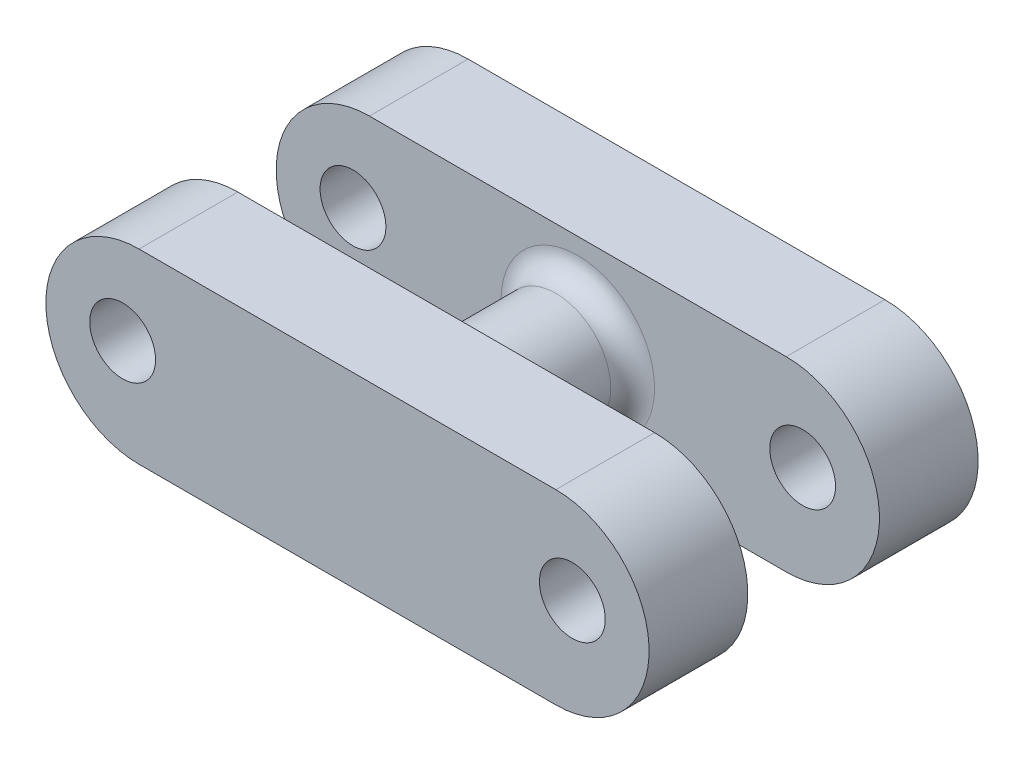
ISO-10303-21;
HEADER;
FILE_DESCRIPTION(('STEP AP214'),'2;1');
FILE_NAME('part.step','',(''),(''),'','','');
FILE_SCHEMA(('AUTOMOTIVE_DESIGN { 1 0 10303 214 1 1 1 1 }'));
ENDSEC;
DATA;
#1=APPLICATION_CONTEXT('core data for automotive mechanical design processes');
#2=APPLICATION_PROTOCOL_DEFINITION('international standard','automotive_design',2000,#1);
#3=PRODUCT_CONTEXT('',#1,'mechanical');
#4=PRODUCT('Part','Part','',(#3));
#5=PRODUCT_RELATED_PRODUCT_CATEGORY('part','',(#4));
#6=PRODUCT_DEFINITION_FORMATION('','',#4);
#7=PRODUCT_DEFINITION_CONTEXT('part definition',#1,'design');
#8=PRODUCT_DEFINITION('design','',#6,#7);
#9=PRODUCT_DEFINITION_SHAPE('','',#8);
#10=(LENGTH_UNIT() NAMED_UNIT(*) SI_UNIT(.MILLI.,.METRE.));
#11=(NAMED_UNIT(*) PLANE_ANGLE_UNIT() SI_UNIT($,.RADIAN.));
#12=(NAMED_UNIT(*) SI_UNIT($,.STERADIAN.) SOLID_ANGLE_UNIT());
#13=UNCERTAINTY_MEASURE_WITH_UNIT(LENGTH_MEASURE(1.E-05),#10,'distance_accuracy_value','');
#14=(GEOMETRIC_REPRESENTATION_CONTEXT(3) GLOBAL_UNCERTAINTY_ASSIGNED_CONTEXT((#13)) GLOBAL_UNIT_ASSIGNED_CONTEXT((#10,
#11,#12)) REPRESENTATION_CONTEXT('',''));
#15=CARTESIAN_POINT('',(0.,0.,0.));
#16=DIRECTION('',(0.,0.,1.));
#17=DIRECTION('',(1.,0.,0.));
#18=AXIS2_PLACEMENT_3D('',#15,#16,#17);
#19=CARTESIAN_POINT('',(8.49999999999999,8.49999999999999,21.));
#20=DIRECTION('',(0.,0.,-1.));
#21=DIRECTION('',(-1.,0.,0.));
#22=AXIS2_PLACEMENT_3D('',#19,#20,#21);
#23=CYLINDRICAL_SURFACE('',#22,8.49999999999999);
#24=DIRECTION('',(0.,0.,-1.));
#25=VECTOR('',#24,1.);
#26=CARTESIAN_POINT('',(8.49999999999999,17.,30.));
#27=LINE('',#26,#25);
#28=CARTESIAN_POINT('',(8.49999999999999,17.,21.));
#29=VERTEX_POINT('',#28);
#30=CARTESIAN_POINT('',(8.5,17.,30.));
#31=VERTEX_POINT('',#30);
#32=EDGE_CURVE('E154',#29,#31,#27,.F.);
#33=ORIENTED_EDGE('',*,*,#32,.F.);
#34=CARTESIAN_POINT('',(8.49999999999999,8.49999999999999,21.));
#35=DIRECTION('',(0.,0.,1.));
#36=DIRECTION('',(1.,0.,0.));
#37=AXIS2_PLACEMENT_3D('',#34,#35,#36);
#38=CIRCLE('',#37,8.49999999999999);
#39=CARTESIAN_POINT('',(8.5,0.,21.));
#40=VERTEX_POINT('',#39);
#41=EDGE_CURVE('E46',#40,#29,#38,.F.);
#42=ORIENTED_EDGE('',*,*,#41,.F.);
#43=DIRECTION('',(0.,0.,-1.));
#44=VECTOR('',#43,1.);
#45=CARTESIAN_POINT('',(8.49999999999999,0.,30.));
#46=LINE('',#45,#44);
#47=CARTESIAN_POINT('',(8.5,0.,30.));
#48=VERTEX_POINT('',#47);
#49=EDGE_CURVE('E157',#48,#40,#46,.T.);
#50=ORIENTED_EDGE('',*,*,#49,.F.);
#51=CARTESIAN_POINT('',(8.49999999999999,8.49999999999999,30.));
#52=DIRECTION('',(0.,0.,-1.));
#53=DIRECTION('',(-1.,0.,0.));
#54=AXIS2_PLACEMENT_3D('',#51,#52,#53);
#55=CIRCLE('',#54,8.49999999999999);
#56=EDGE_CURVE('E11',#31,#48,#55,.F.);
#57=ORIENTED_EDGE('',*,*,#56,.F.);
#58=EDGE_LOOP('',(#33,#42,#50,#57));
#59=FACE_BOUND('',#58,.T.);
#60=ADVANCED_FACE('F38',(#59),#23,.T.);
#61=CARTESIAN_POINT('',(8.5,8.5,0.));
#62=DIRECTION('',(0.,0.,-1.));
#63=DIRECTION('',(-1.,0.,0.));
#64=AXIS2_PLACEMENT_3D('',#61,#62,#63);
#65=CYLINDRICAL_SURFACE('',#64,8.5);
#66=DIRECTION('',(0.,0.,-1.));
#67=VECTOR('',#66,1.);
#68=CARTESIAN_POINT('',(8.5,17.,30.));
#69=LINE('',#68,#67);
#70=CARTESIAN_POINT('',(8.5,17.,0.));
#71=VERTEX_POINT('',#70);
#72=CARTESIAN_POINT('',(8.49999999999999,17.,9.));
#73=VERTEX_POINT('',#72);
#74=EDGE_CURVE('E109',#71,#73,#69,.F.);
#75=ORIENTED_EDGE('',*,*,#74,.F.);
#76=CARTESIAN_POINT('',(8.5,8.5,0.));
#77=DIRECTION('',(0.,0.,-1.));
#78=DIRECTION('',(-1.,0.,0.));
#79=AXIS2_PLACEMENT_3D('',#76,#77,#78);
#80=CIRCLE('',#79,8.5);
#81=CARTESIAN_POINT('',(8.50000000000001,0.,0.));
#82=VERTEX_POINT('',#81);
#83=EDGE_CURVE('E150',#82,#71,#80,.T.);
#84=ORIENTED_EDGE('',*,*,#83,.F.);
#85=DIRECTION('',(0.,0.,-1.));
#86=VECTOR('',#85,1.);
#87=CARTESIAN_POINT('',(8.5,0.,30.));
#88=LINE('',#87,#86);
#89=CARTESIAN_POINT('',(8.5,0.,9.));
#90=VERTEX_POINT('',#89);
#91=EDGE_CURVE('E147',#90,#82,#88,.T.);
#92=ORIENTED_EDGE('',*,*,#91,.F.);
#93=CARTESIAN_POINT('',(8.5,8.5,9.));
#94=DIRECTION('',(0.,0.,-1.));
#95=DIRECTION('',(-1.,0.,0.));
#96=AXIS2_PLACEMENT_3D('',#93,#94,#95);
#97=CIRCLE('',#96,8.5);
#98=EDGE_CURVE('E152',#73,#90,#97,.F.);
#99=ORIENTED_EDGE('',*,*,#98,.F.);
#100=EDGE_LOOP('',(#75,#84,#92,#99));
#101=FACE_BOUND('',#100,.T.);
#102=ADVANCED_FACE('F238',(#101),#65,.T.);
#103=CARTESIAN_POINT('',(46.5,8.5,30.));
#104=DIRECTION('',(0.,0.,-1.));
#105=DIRECTION('',(-1.,0.,0.));
#106=AXIS2_PLACEMENT_3D('',#103,#104,#105);
#107=CYLINDRICAL_SURFACE('',#106,8.5);
#108=DIRECTION('',(0.,0.,-1.));
#109=VECTOR('',#108,1.);
#110=CARTESIAN_POINT('',(46.5,17.,30.));
#111=LINE('',#110,#109);
#112=CARTESIAN_POINT('',(46.5,17.,30.));
#113=VERTEX_POINT('',#112);
#114=CARTESIAN_POINT('',(46.5,17.,21.));
#115=VERTEX_POINT('',#114);
#116=EDGE_CURVE('E135',#113,#115,#111,.T.);
#117=ORIENTED_EDGE('',*,*,#116,.F.);
#118=CARTESIAN_POINT('',(46.5,8.5,30.));
#119=DIRECTION('',(0.,0.,-1.));
#120=DIRECTION('',(-1.,0.,0.));
#121=AXIS2_PLACEMENT_3D('',#118,#119,#120);
#122=CIRCLE('',#121,8.5);
#123=CARTESIAN_POINT('',(46.5,0.,30.));
#124=VERTEX_POINT('',#123);
#125=EDGE_CURVE('E141',#124,#113,#122,.F.);
#126=ORIENTED_EDGE('',*,*,#125,.F.);
#127=DIRECTION('',(0.,0.,-1.));
#128=VECTOR('',#127,1.);
#129=CARTESIAN_POINT('',(46.5,0.,30.));
#130=LINE('',#129,#128);
#131=CARTESIAN_POINT('',(46.5,0.,21.));
#132=VERTEX_POINT('',#131);
#133=EDGE_CURVE('E138',#132,#124,#130,.F.);
#134=ORIENTED_EDGE('',*,*,#133,.F.);
#135=CARTESIAN_POINT('',(46.5,8.5,21.));
#136=DIRECTION('',(0.,0.,1.));
#137=DIRECTION('',(1.,0.,0.));
#138=AXIS2_PLACEMENT_3D('',#135,#136,#137);
#139=CIRCLE('',#138,8.5);
#140=EDGE_CURVE('E143',#115,#132,#139,.F.);
#141=ORIENTED_EDGE('',*,*,#140,.F.);
#142=EDGE_LOOP('',(#117,#126,#134,#141));
#143=FACE_BOUND('',#142,.T.);
#144=ADVANCED_FACE('F242',(#143),#107,.T.);
#145=CARTESIAN_POINT('',(46.5,8.5,9.));
#146=DIRECTION('',(0.,0.,-1.));
#147=DIRECTION('',(-1.,0.,0.));
#148=AXIS2_PLACEMENT_3D('',#145,#146,#147);
#149=CYLINDRICAL_SURFACE('',#148,8.49999999999999);
#150=DIRECTION('',(0.,0.,-1.));
#151=VECTOR('',#150,1.);
#152=CARTESIAN_POINT('',(46.5,17.,30.));
#153=LINE('',#152,#151);
#154=CARTESIAN_POINT('',(46.5,17.,9.));
#155=VERTEX_POINT('',#154);
#156=CARTESIAN_POINT('',(46.5,17.,0.));
#157=VERTEX_POINT('',#156);
#158=EDGE_CURVE('E106',#155,#157,#153,.T.);
#159=ORIENTED_EDGE('',*,*,#158,.F.);
#160=CARTESIAN_POINT('',(46.5,8.5,9.));
#161=DIRECTION('',(0.,0.,-1.));
#162=DIRECTION('',(-1.,0.,0.));
#163=AXIS2_PLACEMENT_3D('',#160,#161,#162);
#164=CIRCLE('',#163,8.49999999999999);
#165=CARTESIAN_POINT('',(46.5,0.,9.));
#166=VERTEX_POINT('',#165);
#167=EDGE_CURVE('E115',#166,#155,#164,.F.);
#168=ORIENTED_EDGE('',*,*,#167,.F.);
#169=DIRECTION('',(0.,0.,-1.));
#170=VECTOR('',#169,1.);
#171=CARTESIAN_POINT('',(46.5,0.,30.));
#172=LINE('',#171,#170);
#173=CARTESIAN_POINT('',(46.5,0.,0.));
#174=VERTEX_POINT('',#173);
#175=EDGE_CURVE('E122',#174,#166,#172,.F.);
#176=ORIENTED_EDGE('',*,*,#175,.F.);
#177=CARTESIAN_POINT('',(46.5,8.5,0.));
#178=DIRECTION('',(0.,0.,-1.));
#179=DIRECTION('',(-1.,0.,0.));
#180=AXIS2_PLACEMENT_3D('',#177,#178,#179);
#181=CIRCLE('',#180,8.49999999999999);
#182=EDGE_CURVE('E121',#157,#174,#181,.T.);
#183=ORIENTED_EDGE('',*,*,#182,.F.);
#184=EDGE_LOOP('',(#159,#168,#176,#183));
#185=FACE_BOUND('',#184,.T.);
#186=ADVANCED_FACE('F124',(#185),#149,.T.);
#187=CARTESIAN_POINT('',(27.5,8.5,44.142135623731));
#188=DIRECTION('',(0.,0.,-1.));
#189=DIRECTION('',(-1.,0.,0.));
#190=AXIS2_PLACEMENT_3D('',#187,#188,#189);
#191=CYLINDRICAL_SURFACE('',#190,5.);
#192=CARTESIAN_POINT('',(27.5,8.5,11.));
#193=DIRECTION('',(0.,0.,-1.));
#194=DIRECTION('',(-1.,0.,0.));
#195=AXIS2_PLACEMENT_3D('',#192,#193,#194);
#196=CIRCLE('',#195,5.);
#197=CARTESIAN_POINT('',(22.5,8.5,11.));
#198=VERTEX_POINT('',#197);
#199=EDGE_CURVE('E130',#198,#198,#196,.F.);
#200=ORIENTED_EDGE('',*,*,#199,.T.);
#201=EDGE_LOOP('',(#200));
#202=FACE_BOUND('',#201,.T.);
#203=CARTESIAN_POINT('',(27.5,8.5,19.));
#204=DIRECTION('',(0.,0.,1.));
#205=DIRECTION('',(1.,0.,0.));
#206=AXIS2_PLACEMENT_3D('',#203,#204,#205);
#207=CIRCLE('',#206,5.);
#208=CARTESIAN_POINT('',(32.5,8.5,19.));
#209=VERTEX_POINT('',#208);
#210=EDGE_CURVE('E196',#209,#209,#207,.F.);
#211=ORIENTED_EDGE('',*,*,#210,.T.);
#212=EDGE_LOOP('',(#211));
#213=FACE_BOUND('',#212,.T.);
#214=ADVANCED_FACE('F201',(#202,#213),#191,.T.);
#215=CARTESIAN_POINT('',(55.,0.,30.));
#216=DIRECTION('',(0.,1.,0.));
#217=DIRECTION('',(-1.,0.,0.));
#218=AXIS2_PLACEMENT_3D('',#215,#216,#217);
#219=PLANE('',#218);
#220=DIRECTION('',(1.,0.,0.));
#221=VECTOR('',#220,1.);
#222=CARTESIAN_POINT('',(0.,0.,9.));
#223=LINE('',#222,#221);
#224=EDGE_CURVE('E112',#90,#166,#223,.T.);
#225=ORIENTED_EDGE('',*,*,#224,.F.);
#226=ORIENTED_EDGE('',*,*,#91,.T.);
#227=DIRECTION('',(1.,0.,0.));
#228=VECTOR('',#227,1.);
#229=CARTESIAN_POINT('',(55.,0.,0.));
#230=LINE('',#229,#228);
#231=EDGE_CURVE('E189',#82,#174,#230,.T.);
#232=ORIENTED_EDGE('',*,*,#231,.T.);
#233=ORIENTED_EDGE('',*,*,#175,.T.);
#234=EDGE_LOOP('',(#225,#226,#232,#233));
#235=FACE_BOUND('',#234,.T.);
#236=ADVANCED_FACE('F265',(#235),#219,.F.);
#237=CARTESIAN_POINT('',(0.,17.,30.));
#238=DIRECTION('',(0.,-1.,0.));
#239=DIRECTION('',(0.,0.,-1.));
#240=AXIS2_PLACEMENT_3D('',#237,#238,#239);
#241=PLANE('',#240);
#242=DIRECTION('',(-1.,0.,0.));
#243=VECTOR('',#242,1.);
#244=CARTESIAN_POINT('',(0.,17.,0.));
#245=LINE('',#244,#243);
#246=EDGE_CURVE('E187',#157,#71,#245,.T.);
#247=ORIENTED_EDGE('',*,*,#246,.T.);
#248=ORIENTED_EDGE('',*,*,#74,.T.);
#249=DIRECTION('',(1.,0.,0.));
#250=VECTOR('',#249,1.);
#251=CARTESIAN_POINT('',(0.,17.,9.));
#252=LINE('',#251,#250);
#253=EDGE_CURVE('E101',#73,#155,#252,.T.);
#254=ORIENTED_EDGE('',*,*,#253,.T.);
#255=ORIENTED_EDGE('',*,*,#158,.T.);
#256=EDGE_LOOP('',(#247,#248,#254,#255));
#257=FACE_BOUND('',#256,.T.);
#258=ADVANCED_FACE('F104',(#257),#241,.F.);
#259=CARTESIAN_POINT('',(48.,9.,30.));
#260=DIRECTION('',(0.,0.,-1.));
#261=DIRECTION('',(-1.,0.,0.));
#262=AXIS2_PLACEMENT_3D('',#259,#260,#261);
#263=CYLINDRICAL_SURFACE('',#262,3.00000000000001);
#264=CARTESIAN_POINT('',(48.,9.,9.));
#265=DIRECTION('',(0.,0.,-1.));
#266=DIRECTION('',(-1.,0.,0.));
#267=AXIS2_PLACEMENT_3D('',#264,#265,#266);
#268=CIRCLE('',#267,3.00000000000001);
#269=CARTESIAN_POINT('',(45.,9.,9.));
#270=VERTEX_POINT('',#269);
#271=EDGE_CURVE('E178',#270,#270,#268,.T.);
#272=ORIENTED_EDGE('',*,*,#271,.F.);
#273=EDGE_LOOP('',(#272));
#274=FACE_BOUND('',#273,.T.);
#275=CARTESIAN_POINT('',(48.,9.,0.));
#276=DIRECTION('',(0.,0.,1.));
#277=DIRECTION('',(1.,0.,0.));
#278=AXIS2_PLACEMENT_3D('',#275,#276,#277);
#279=CIRCLE('',#278,3.00000000000001);
#280=CARTESIAN_POINT('',(51.,9.,0.));
#281=VERTEX_POINT('',#280);
#282=EDGE_CURVE('E184',#281,#281,#279,.T.);
#283=ORIENTED_EDGE('',*,*,#282,.F.);
#284=EDGE_LOOP('',(#283));
#285=FACE_BOUND('',#284,.T.);
#286=ADVANCED_FACE('F227',(#274,#285),#263,.F.);
#287=CARTESIAN_POINT('',(0.,0.,0.));
#288=DIRECTION('',(0.,0.,-1.));
#289=DIRECTION('',(-1.,0.,0.));
#290=AXIS2_PLACEMENT_3D('',#287,#288,#289);
#291=PLANE('',#290);
#292=ORIENTED_EDGE('',*,*,#282,.T.);
#293=EDGE_LOOP('',(#292));
#294=FACE_BOUND('',#293,.T.);
#295=ORIENTED_EDGE('',*,*,#231,.F.);
#296=ORIENTED_EDGE('',*,*,#83,.T.);
#297=ORIENTED_EDGE('',*,*,#246,.F.);
#298=ORIENTED_EDGE('',*,*,#182,.T.);
#299=EDGE_LOOP('',(#295,#296,#297,#298));
#300=FACE_BOUND('',#299,.T.);
#301=CARTESIAN_POINT('',(6.99999999999999,9.,0.));
#302=DIRECTION('',(0.,0.,1.));
#303=DIRECTION('',(1.,0.,0.));
#304=AXIS2_PLACEMENT_3D('',#301,#302,#303);
#305=CIRCLE('',#304,3.);
#306=CARTESIAN_POINT('',(9.99999999999999,9.,0.));
#307=VERTEX_POINT('',#306);
#308=EDGE_CURVE('E181',#307,#307,#305,.T.);
#309=ORIENTED_EDGE('',*,*,#308,.T.);
#310=EDGE_LOOP('',(#309));
#311=FACE_BOUND('',#310,.T.);
#312=ADVANCED_FACE('F222',(#294,#300,#311),#291,.T.);
#313=CARTESIAN_POINT('',(6.99999999999999,9.,30.));
#314=DIRECTION('',(0.,0.,-1.));
#315=DIRECTION('',(-1.,0.,0.));
#316=AXIS2_PLACEMENT_3D('',#313,#314,#315);
#317=CYLINDRICAL_SURFACE('',#316,3.);
#318=CARTESIAN_POINT('',(6.99999999999999,9.,9.));
#319=DIRECTION('',(0.,0.,-1.));
#320=DIRECTION('',(-1.,0.,0.));
#321=AXIS2_PLACEMENT_3D('',#318,#319,#320);
#322=CIRCLE('',#321,3.);
#323=CARTESIAN_POINT('',(3.99999999999999,9.,9.));
#324=VERTEX_POINT('',#323);
#325=EDGE_CURVE('E111',#324,#324,#322,.T.);
#326=ORIENTED_EDGE('',*,*,#325,.F.);
#327=EDGE_LOOP('',(#326));
#328=FACE_BOUND('',#327,.T.);
#329=ORIENTED_EDGE('',*,*,#308,.F.);
#330=EDGE_LOOP('',(#329));
#331=FACE_BOUND('',#330,.T.);
#332=ADVANCED_FACE('F214',(#328,#331),#317,.F.);
#333=CARTESIAN_POINT('',(0.,0.,9.));
#334=DIRECTION('',(0.,0.,-1.));
#335=DIRECTION('',(-1.,0.,0.));
#336=AXIS2_PLACEMENT_3D('',#333,#334,#335);
#337=PLANE('',#336);
#338=CARTESIAN_POINT('',(27.5,8.5,9.));
#339=DIRECTION('',(0.,0.,-1.));
#340=DIRECTION('',(-1.,0.,0.));
#341=AXIS2_PLACEMENT_3D('',#338,#339,#340);
#342=CIRCLE('',#341,7.);
#343=CARTESIAN_POINT('',(20.5,8.5,9.));
#344=VERTEX_POINT('',#343);
#345=EDGE_CURVE('E191',#344,#344,#342,.T.);
#346=ORIENTED_EDGE('',*,*,#345,.T.);
#347=EDGE_LOOP('',(#346));
#348=FACE_BOUND('',#347,.T.);
#349=ORIENTED_EDGE('',*,*,#271,.T.);
#350=EDGE_LOOP('',(#349));
#351=FACE_BOUND('',#350,.T.);
#352=ORIENTED_EDGE('',*,*,#325,.T.);
#353=EDGE_LOOP('',(#352));
#354=FACE_BOUND('',#353,.T.);
#355=ORIENTED_EDGE('',*,*,#253,.F.);
#356=ORIENTED_EDGE('',*,*,#98,.T.);
#357=ORIENTED_EDGE('',*,*,#224,.T.);
#358=ORIENTED_EDGE('',*,*,#167,.T.);
#359=EDGE_LOOP('',(#355,#356,#357,#358));
#360=FACE_BOUND('',#359,.T.);
#361=ADVANCED_FACE('F116',(#348,#351,#354,#360),#337,.F.);
#362=CARTESIAN_POINT('',(0.,17.,30.));
#363=DIRECTION('',(0.,-1.,0.));
#364=DIRECTION('',(0.,0.,-1.));
#365=AXIS2_PLACEMENT_3D('',#362,#363,#364);
#366=PLANE('',#365);
#367=DIRECTION('',(1.,0.,0.));
#368=VECTOR('',#367,1.);
#369=CARTESIAN_POINT('',(0.,17.,21.));
#370=LINE('',#369,#368);
#371=EDGE_CURVE('E162',#29,#115,#370,.T.);
#372=ORIENTED_EDGE('',*,*,#371,.F.);
#373=ORIENTED_EDGE('',*,*,#32,.T.);
#374=DIRECTION('',(-1.,0.,0.));
#375=VECTOR('',#374,1.);
#376=CARTESIAN_POINT('',(0.,17.,30.));
#377=LINE('',#376,#375);
#378=EDGE_CURVE('E308',#113,#31,#377,.T.);
#379=ORIENTED_EDGE('',*,*,#378,.F.);
#380=ORIENTED_EDGE('',*,*,#116,.T.);
#381=EDGE_LOOP('',(#372,#373,#379,#380));
#382=FACE_BOUND('',#381,.T.);
#383=ADVANCED_FACE('F167',(#382),#366,.F.);
#384=CARTESIAN_POINT('',(55.,0.,30.));
#385=DIRECTION('',(0.,1.,0.));
#386=DIRECTION('',(-1.,0.,0.));
#387=AXIS2_PLACEMENT_3D('',#384,#385,#386);
#388=PLANE('',#387);
#389=DIRECTION('',(1.,0.,0.));
#390=VECTOR('',#389,1.);
#391=CARTESIAN_POINT('',(10.,0.,30.));
#392=LINE('',#391,#390);
#393=EDGE_CURVE('E311',#48,#124,#392,.T.);
#394=ORIENTED_EDGE('',*,*,#393,.F.);
#395=ORIENTED_EDGE('',*,*,#49,.T.);
#396=DIRECTION('',(1.,0.,0.));
#397=VECTOR('',#396,1.);
#398=CARTESIAN_POINT('',(0.,0.,21.));
#399=LINE('',#398,#397);
#400=EDGE_CURVE('E164',#40,#132,#399,.T.);
#401=ORIENTED_EDGE('',*,*,#400,.T.);
#402=ORIENTED_EDGE('',*,*,#133,.T.);
#403=EDGE_LOOP('',(#394,#395,#401,#402));
#404=FACE_BOUND('',#403,.T.);
#405=ADVANCED_FACE('F286',(#404),#388,.F.);
#406=CARTESIAN_POINT('',(48.,9.,30.));
#407=DIRECTION('',(0.,0.,-1.));
#408=DIRECTION('',(-1.,0.,0.));
#409=AXIS2_PLACEMENT_3D('',#406,#407,#408);
#410=CYLINDRICAL_SURFACE('',#409,3.00000000000001);
#411=CARTESIAN_POINT('',(48.,9.,21.));
#412=DIRECTION('',(0.,0.,1.));
#413=DIRECTION('',(1.,0.,0.));
#414=AXIS2_PLACEMENT_3D('',#411,#412,#413);
#415=CIRCLE('',#414,3.00000000000001);
#416=CARTESIAN_POINT('',(51.,9.,21.));
#417=VERTEX_POINT('',#416);
#418=EDGE_CURVE('E173',#417,#417,#415,.T.);
#419=ORIENTED_EDGE('',*,*,#418,.F.);
#420=EDGE_LOOP('',(#419));
#421=FACE_BOUND('',#420,.T.);
#422=CARTESIAN_POINT('',(48.,9.,30.));
#423=DIRECTION('',(0.,0.,1.));
#424=DIRECTION('',(1.,0.,0.));
#425=AXIS2_PLACEMENT_3D('',#422,#423,#424);
#426=CIRCLE('',#425,3.00000000000001);
#427=CARTESIAN_POINT('',(51.,9.,30.));
#428=VERTEX_POINT('',#427);
#429=EDGE_CURVE('E309',#428,#428,#426,.T.);
#430=ORIENTED_EDGE('',*,*,#429,.T.);
#431=EDGE_LOOP('',(#430));
#432=FACE_BOUND('',#431,.T.);
#433=ADVANCED_FACE('F282',(#421,#432),#410,.F.);
#434=CARTESIAN_POINT('',(6.99999999999999,9.,30.));
#435=DIRECTION('',(0.,0.,-1.));
#436=DIRECTION('',(-1.,0.,0.));
#437=AXIS2_PLACEMENT_3D('',#434,#435,#436);
#438=CYLINDRICAL_SURFACE('',#437,3.);
#439=CARTESIAN_POINT('',(6.99999999999999,9.,21.));
#440=DIRECTION('',(0.,0.,1.));
#441=DIRECTION('',(1.,0.,0.));
#442=AXIS2_PLACEMENT_3D('',#439,#440,#441);
#443=CIRCLE('',#442,3.);
#444=CARTESIAN_POINT('',(9.99999999999999,9.,21.));
#445=VERTEX_POINT('',#444);
#446=EDGE_CURVE('E169',#445,#445,#443,.T.);
#447=ORIENTED_EDGE('',*,*,#446,.F.);
#448=EDGE_LOOP('',(#447));
#449=FACE_BOUND('',#448,.T.);
#450=CARTESIAN_POINT('',(6.99999999999999,9.,30.));
#451=DIRECTION('',(0.,0.,1.));
#452=DIRECTION('',(1.,0.,0.));
#453=AXIS2_PLACEMENT_3D('',#450,#451,#452);
#454=CIRCLE('',#453,3.);
#455=CARTESIAN_POINT('',(9.99999999999999,9.,30.));
#456=VERTEX_POINT('',#455);
#457=EDGE_CURVE('E306',#456,#456,#454,.T.);
#458=ORIENTED_EDGE('',*,*,#457,.T.);
#459=EDGE_LOOP('',(#458));
#460=FACE_BOUND('',#459,.T.);
#461=ADVANCED_FACE('F279',(#449,#460),#438,.F.);
#462=CARTESIAN_POINT('',(0.,0.,21.));
#463=DIRECTION('',(0.,0.,1.));
#464=DIRECTION('',(1.,0.,0.));
#465=AXIS2_PLACEMENT_3D('',#462,#463,#464);
#466=PLANE('',#465);
#467=CARTESIAN_POINT('',(27.5,8.5,21.));
#468=DIRECTION('',(0.,0.,1.));
#469=DIRECTION('',(1.,0.,0.));
#470=AXIS2_PLACEMENT_3D('',#467,#468,#469);
#471=CIRCLE('',#470,7.);
#472=CARTESIAN_POINT('',(34.5,8.5,21.));
#473=VERTEX_POINT('',#472);
#474=EDGE_CURVE('E126',#473,#473,#471,.T.);
#475=ORIENTED_EDGE('',*,*,#474,.T.);
#476=EDGE_LOOP('',(#475));
#477=FACE_BOUND('',#476,.T.);
#478=ORIENTED_EDGE('',*,*,#418,.T.);
#479=EDGE_LOOP('',(#478));
#480=FACE_BOUND('',#479,.T.);
#481=ORIENTED_EDGE('',*,*,#446,.T.);
#482=EDGE_LOOP('',(#481));
#483=FACE_BOUND('',#482,.T.);
#484=ORIENTED_EDGE('',*,*,#400,.F.);
#485=ORIENTED_EDGE('',*,*,#41,.T.);
#486=ORIENTED_EDGE('',*,*,#371,.T.);
#487=ORIENTED_EDGE('',*,*,#140,.T.);
#488=EDGE_LOOP('',(#484,#485,#486,#487));
#489=FACE_BOUND('',#488,.T.);
#490=ADVANCED_FACE('F160',(#477,#480,#483,#489),#466,.F.);
#491=CARTESIAN_POINT('',(0.,0.,30.));
#492=DIRECTION('',(0.,0.,-1.));
#493=DIRECTION('',(-1.,0.,0.));
#494=AXIS2_PLACEMENT_3D('',#491,#492,#493);
#495=PLANE('',#494);
#496=ORIENTED_EDGE('',*,*,#378,.T.);
#497=ORIENTED_EDGE('',*,*,#56,.T.);
#498=ORIENTED_EDGE('',*,*,#393,.T.);
#499=ORIENTED_EDGE('',*,*,#125,.T.);
#500=EDGE_LOOP('',(#496,#497,#498,#499));
#501=FACE_BOUND('',#500,.T.);
#502=ORIENTED_EDGE('',*,*,#429,.F.);
#503=EDGE_LOOP('',(#502));
#504=FACE_BOUND('',#503,.T.);
#505=ORIENTED_EDGE('',*,*,#457,.F.);
#506=EDGE_LOOP('',(#505));
#507=FACE_BOUND('',#506,.T.);
#508=ADVANCED_FACE('F208',(#501,#504,#507),#495,.F.);
#509=CARTESIAN_POINT('',(27.5,8.5,11.));
#510=DIRECTION('',(0.,0.,-1.));
#511=DIRECTION('',(-1.,0.,0.));
#512=AXIS2_PLACEMENT_3D('',#509,#510,#511);
#513=TOROIDAL_SURFACE('',#512,7.,2.);
#514=ORIENTED_EDGE('',*,*,#199,.F.);
#515=EDGE_LOOP('',(#514));
#516=FACE_BOUND('',#515,.T.);
#517=ORIENTED_EDGE('',*,*,#345,.F.);
#518=EDGE_LOOP('',(#517));
#519=FACE_BOUND('',#518,.T.);
#520=ADVANCED_FACE('F204',(#516,#519),#513,.F.);
#521=CARTESIAN_POINT('',(27.5,8.5,19.));
#522=DIRECTION('',(0.,0.,1.));
#523=DIRECTION('',(1.,0.,0.));
#524=AXIS2_PLACEMENT_3D('',#521,#522,#523);
#525=TOROIDAL_SURFACE('',#524,7.,2.);
#526=ORIENTED_EDGE('',*,*,#474,.F.);
#527=EDGE_LOOP('',(#526));
#528=FACE_BOUND('',#527,.T.);
#529=ORIENTED_EDGE('',*,*,#210,.F.);
#530=EDGE_LOOP('',(#529));
#531=FACE_BOUND('',#530,.T.);
#532=ADVANCED_FACE('F207',(#528,#531),#525,.F.);
#533=CLOSED_SHELL('',(#60,#102,#144,#186,#214,#236,#258,#286,#312,#332,#361,#383,#405,#433,#461,
#490,#508,#520,#532));
#534=MANIFOLD_SOLID_BREP('B2',#533);
#535=ADVANCED_BREP_SHAPE_REPRESENTATION('',(#18,#534),#14);
#536=SHAPE_DEFINITION_REPRESENTATION(#9,#535);
ENDSEC;
END-ISO-10303-21;
